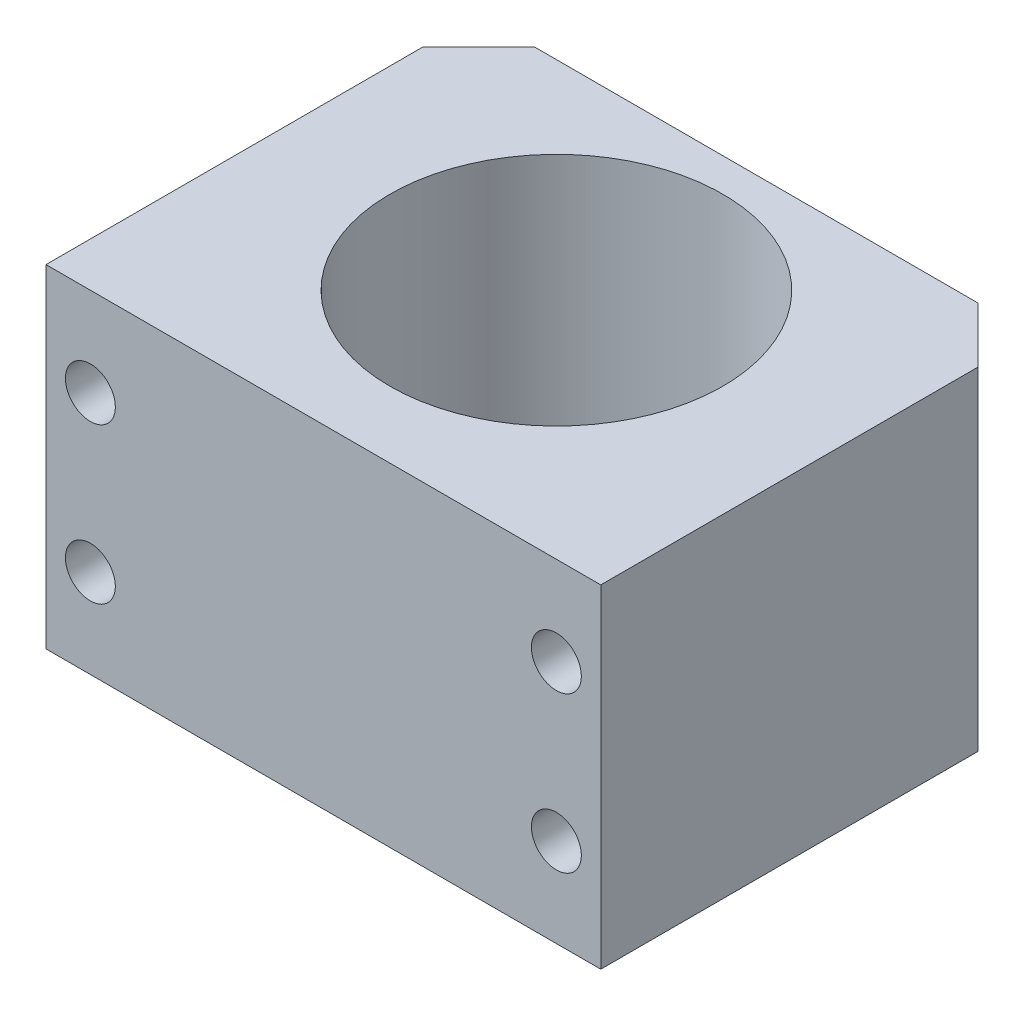
ISO-10303-21;
HEADER;
FILE_DESCRIPTION(('STEP AP214'),'2;1');
FILE_NAME('part.step','',(''),(''),'','','');
FILE_SCHEMA(('AUTOMOTIVE_DESIGN { 1 0 10303 214 1 1 1 1 }'));
ENDSEC;
DATA;
#1=APPLICATION_CONTEXT('core data for automotive mechanical design processes');
#2=APPLICATION_PROTOCOL_DEFINITION('international standard','automotive_design',2000,#1);
#3=PRODUCT_CONTEXT('',#1,'mechanical');
#4=PRODUCT('Part','Part','',(#3));
#5=PRODUCT_RELATED_PRODUCT_CATEGORY('part','',(#4));
#6=PRODUCT_DEFINITION_FORMATION('','',#4);
#7=PRODUCT_DEFINITION_CONTEXT('part definition',#1,'design');
#8=PRODUCT_DEFINITION('design','',#6,#7);
#9=PRODUCT_DEFINITION_SHAPE('','',#8);
#10=(LENGTH_UNIT() NAMED_UNIT(*) SI_UNIT(.MILLI.,.METRE.));
#11=(NAMED_UNIT(*) PLANE_ANGLE_UNIT() SI_UNIT($,.RADIAN.));
#12=(NAMED_UNIT(*) SI_UNIT($,.STERADIAN.) SOLID_ANGLE_UNIT());
#13=UNCERTAINTY_MEASURE_WITH_UNIT(LENGTH_MEASURE(1.E-05),#10,'distance_accuracy_value','');
#14=(GEOMETRIC_REPRESENTATION_CONTEXT(3) GLOBAL_UNCERTAINTY_ASSIGNED_CONTEXT((#13)) GLOBAL_UNIT_ASSIGNED_CONTEXT((#10,
#11,#12)) REPRESENTATION_CONTEXT('',''));
#15=CARTESIAN_POINT('',(0.,0.,0.));
#16=DIRECTION('',(0.,0.,1.));
#17=DIRECTION('',(1.,0.,0.));
#18=AXIS2_PLACEMENT_3D('',#15,#16,#17);
#19=CARTESIAN_POINT('',(25.,30.,19.5));
#20=DIRECTION('',(-1.,0.,0.));
#21=DIRECTION('',(0.,0.,1.));
#22=AXIS2_PLACEMENT_3D('',#19,#20,#21);
#23=PLANE('',#22);
#24=DIRECTION('',(0.,0.,-1.));
#25=VECTOR('',#24,1.);
#26=CARTESIAN_POINT('',(25.,0.,19.5));
#27=LINE('',#26,#25);
#28=CARTESIAN_POINT('',(25.,0.,19.5));
#29=VERTEX_POINT('',#28);
#30=CARTESIAN_POINT('',(25.,0.,-14.5));
#31=VERTEX_POINT('',#30);
#32=EDGE_CURVE('E135',#29,#31,#27,.T.);
#33=ORIENTED_EDGE('',*,*,#32,.T.);
#34=DIRECTION('',(0.,1.,0.));
#35=VECTOR('',#34,1.);
#36=CARTESIAN_POINT('',(25.,30.,-14.5));
#37=LINE('',#36,#35);
#38=CARTESIAN_POINT('',(25.,30.,-14.5));
#39=VERTEX_POINT('',#38);
#40=EDGE_CURVE('E55',#31,#39,#37,.T.);
#41=ORIENTED_EDGE('',*,*,#40,.T.);
#42=DIRECTION('',(0.,0.,-1.));
#43=VECTOR('',#42,1.);
#44=CARTESIAN_POINT('',(25.,30.,19.5));
#45=LINE('',#44,#43);
#46=CARTESIAN_POINT('',(25.,30.,19.5));
#47=VERTEX_POINT('',#46);
#48=EDGE_CURVE('E138',#47,#39,#45,.T.);
#49=ORIENTED_EDGE('',*,*,#48,.F.);
#50=DIRECTION('',(0.,-1.,0.));
#51=VECTOR('',#50,1.);
#52=CARTESIAN_POINT('',(25.,30.,19.5));
#53=LINE('',#52,#51);
#54=EDGE_CURVE('E147',#47,#29,#53,.T.);
#55=ORIENTED_EDGE('',*,*,#54,.T.);
#56=EDGE_LOOP('',(#33,#41,#49,#55));
#57=FACE_BOUND('',#56,.T.);
#58=ADVANCED_FACE('F32',(#57),#23,.F.);
#59=CARTESIAN_POINT('',(-25.,30.,-19.5));
#60=DIRECTION('',(0.,0.,1.));
#61=DIRECTION('',(1.,0.,0.));
#62=AXIS2_PLACEMENT_3D('',#59,#60,#61);
#63=PLANE('',#62);
#64=DIRECTION('',(-1.,0.,0.));
#65=VECTOR('',#64,1.);
#66=CARTESIAN_POINT('',(-25.,30.,-19.5));
#67=LINE('',#66,#65);
#68=CARTESIAN_POINT('',(20.,30.,-19.5));
#69=VERTEX_POINT('',#68);
#70=CARTESIAN_POINT('',(-20.,30.,-19.5));
#71=VERTEX_POINT('',#70);
#72=EDGE_CURVE('E140',#69,#71,#67,.T.);
#73=ORIENTED_EDGE('',*,*,#72,.F.);
#74=DIRECTION('',(0.,-1.,0.));
#75=VECTOR('',#74,1.);
#76=CARTESIAN_POINT('',(20.,30.,-19.5));
#77=LINE('',#76,#75);
#78=CARTESIAN_POINT('',(20.,0.,-19.5));
#79=VERTEX_POINT('',#78);
#80=EDGE_CURVE('E162',#69,#79,#77,.T.);
#81=ORIENTED_EDGE('',*,*,#80,.T.);
#82=DIRECTION('',(-1.,0.,0.));
#83=VECTOR('',#82,1.);
#84=CARTESIAN_POINT('',(-25.,0.,-19.5));
#85=LINE('',#84,#83);
#86=CARTESIAN_POINT('',(-20.,0.,-19.5));
#87=VERTEX_POINT('',#86);
#88=EDGE_CURVE('E149',#79,#87,#85,.T.);
#89=ORIENTED_EDGE('',*,*,#88,.T.);
#90=DIRECTION('',(0.,1.,0.));
#91=VECTOR('',#90,1.);
#92=CARTESIAN_POINT('',(-20.,30.,-19.5));
#93=LINE('',#92,#91);
#94=EDGE_CURVE('E160',#87,#71,#93,.T.);
#95=ORIENTED_EDGE('',*,*,#94,.T.);
#96=EDGE_LOOP('',(#73,#81,#89,#95));
#97=FACE_BOUND('',#96,.T.);
#98=ADVANCED_FACE('F176',(#97),#63,.F.);
#99=CARTESIAN_POINT('',(-25.,30.,19.5));
#100=DIRECTION('',(1.,0.,0.));
#101=DIRECTION('',(0.,0.,-1.));
#102=AXIS2_PLACEMENT_3D('',#99,#100,#101);
#103=PLANE('',#102);
#104=DIRECTION('',(0.,0.,1.));
#105=VECTOR('',#104,1.);
#106=CARTESIAN_POINT('',(-25.,30.,19.5));
#107=LINE('',#106,#105);
#108=CARTESIAN_POINT('',(-25.,30.,-14.5));
#109=VERTEX_POINT('',#108);
#110=CARTESIAN_POINT('',(-25.,30.,19.5));
#111=VERTEX_POINT('',#110);
#112=EDGE_CURVE('E143',#109,#111,#107,.T.);
#113=ORIENTED_EDGE('',*,*,#112,.F.);
#114=DIRECTION('',(0.,-1.,0.));
#115=VECTOR('',#114,1.);
#116=CARTESIAN_POINT('',(-25.,30.,-14.5));
#117=LINE('',#116,#115);
#118=CARTESIAN_POINT('',(-25.,0.,-14.5));
#119=VERTEX_POINT('',#118);
#120=EDGE_CURVE('E11',#109,#119,#117,.T.);
#121=ORIENTED_EDGE('',*,*,#120,.T.);
#122=DIRECTION('',(0.,0.,1.));
#123=VECTOR('',#122,1.);
#124=CARTESIAN_POINT('',(-25.,0.,19.5));
#125=LINE('',#124,#123);
#126=CARTESIAN_POINT('',(-25.,0.,19.5));
#127=VERTEX_POINT('',#126);
#128=EDGE_CURVE('E152',#119,#127,#125,.T.);
#129=ORIENTED_EDGE('',*,*,#128,.T.);
#130=DIRECTION('',(0.,-1.,0.));
#131=VECTOR('',#130,1.);
#132=CARTESIAN_POINT('',(-25.,30.,19.5));
#133=LINE('',#132,#131);
#134=EDGE_CURVE('E157',#111,#127,#133,.T.);
#135=ORIENTED_EDGE('',*,*,#134,.F.);
#136=EDGE_LOOP('',(#113,#121,#129,#135));
#137=FACE_BOUND('',#136,.T.);
#138=ADVANCED_FACE('F191',(#137),#103,.F.);
#139=CARTESIAN_POINT('',(-25.,30.,19.5));
#140=DIRECTION('',(0.,0.,-1.));
#141=DIRECTION('',(-1.,0.,0.));
#142=AXIS2_PLACEMENT_3D('',#139,#140,#141);
#143=PLANE('',#142);
#144=CARTESIAN_POINT('',(-21.,22.,19.5));
#145=DIRECTION('',(0.,0.,1.));
#146=DIRECTION('',(1.,0.,0.));
#147=AXIS2_PLACEMENT_3D('',#144,#145,#146);
#148=CIRCLE('',#147,2.25);
#149=CARTESIAN_POINT('',(-18.75,22.,19.5));
#150=VERTEX_POINT('',#149);
#151=EDGE_CURVE('E109',#150,#150,#148,.T.);
#152=ORIENTED_EDGE('',*,*,#151,.F.);
#153=EDGE_LOOP('',(#152));
#154=FACE_BOUND('',#153,.T.);
#155=CARTESIAN_POINT('',(21.,22.,19.5));
#156=DIRECTION('',(0.,0.,1.));
#157=DIRECTION('',(1.,0.,0.));
#158=AXIS2_PLACEMENT_3D('',#155,#156,#157);
#159=CIRCLE('',#158,2.25);
#160=CARTESIAN_POINT('',(23.25,22.,19.5));
#161=VERTEX_POINT('',#160);
#162=EDGE_CURVE('E108',#161,#161,#159,.T.);
#163=ORIENTED_EDGE('',*,*,#162,.F.);
#164=EDGE_LOOP('',(#163));
#165=FACE_BOUND('',#164,.T.);
#166=CARTESIAN_POINT('',(21.,8.,19.5));
#167=DIRECTION('',(0.,0.,1.));
#168=DIRECTION('',(1.,0.,0.));
#169=AXIS2_PLACEMENT_3D('',#166,#167,#168);
#170=CIRCLE('',#169,2.25);
#171=CARTESIAN_POINT('',(23.25,8.,19.5));
#172=VERTEX_POINT('',#171);
#173=EDGE_CURVE('E119',#172,#172,#170,.T.);
#174=ORIENTED_EDGE('',*,*,#173,.F.);
#175=EDGE_LOOP('',(#174));
#176=FACE_BOUND('',#175,.T.);
#177=CARTESIAN_POINT('',(-21.,8.,19.5));
#178=DIRECTION('',(0.,0.,1.));
#179=DIRECTION('',(1.,0.,0.));
#180=AXIS2_PLACEMENT_3D('',#177,#178,#179);
#181=CIRCLE('',#180,2.25);
#182=CARTESIAN_POINT('',(-18.75,8.,19.5));
#183=VERTEX_POINT('',#182);
#184=EDGE_CURVE('E125',#183,#183,#181,.T.);
#185=ORIENTED_EDGE('',*,*,#184,.F.);
#186=EDGE_LOOP('',(#185));
#187=FACE_BOUND('',#186,.T.);
#188=DIRECTION('',(1.,0.,0.));
#189=VECTOR('',#188,1.);
#190=CARTESIAN_POINT('',(-25.,0.,19.5));
#191=LINE('',#190,#189);
#192=EDGE_CURVE('E141',#127,#29,#191,.T.);
#193=ORIENTED_EDGE('',*,*,#192,.T.);
#194=ORIENTED_EDGE('',*,*,#54,.F.);
#195=DIRECTION('',(1.,0.,0.));
#196=VECTOR('',#195,1.);
#197=CARTESIAN_POINT('',(-25.,30.,19.5));
#198=LINE('',#197,#196);
#199=EDGE_CURVE('E145',#111,#47,#198,.T.);
#200=ORIENTED_EDGE('',*,*,#199,.F.);
#201=ORIENTED_EDGE('',*,*,#134,.T.);
#202=EDGE_LOOP('',(#193,#194,#200,#201));
#203=FACE_BOUND('',#202,.T.);
#204=ADVANCED_FACE('F187',(#154,#165,#176,#187,#203),#143,.F.);
#205=CARTESIAN_POINT('',(0.,30.,0.));
#206=DIRECTION('',(0.,-1.,0.));
#207=DIRECTION('',(0.,0.,-1.));
#208=AXIS2_PLACEMENT_3D('',#205,#206,#207);
#209=PLANE('',#208);
#210=CARTESIAN_POINT('',(0.,30.,-1.50000000000001));
#211=DIRECTION('',(0.,1.,0.));
#212=DIRECTION('',(0.,0.,1.));
#213=AXIS2_PLACEMENT_3D('',#210,#211,#212);
#214=CIRCLE('',#213,15.);
#215=CARTESIAN_POINT('',(0.,30.,13.5));
#216=VERTEX_POINT('',#215);
#217=EDGE_CURVE('E131',#216,#216,#214,.T.);
#218=ORIENTED_EDGE('',*,*,#217,.F.);
#219=EDGE_LOOP('',(#218));
#220=FACE_BOUND('',#219,.T.);
#221=ORIENTED_EDGE('',*,*,#48,.T.);
#222=DIRECTION('',(0.707106781186547,0.,0.707106781186549));
#223=VECTOR('',#222,1.);
#224=CARTESIAN_POINT('',(20.,30.,-19.5));
#225=LINE('',#224,#223);
#226=EDGE_CURVE('E40',#39,#69,#225,.F.);
#227=ORIENTED_EDGE('',*,*,#226,.T.);
#228=ORIENTED_EDGE('',*,*,#72,.T.);
#229=DIRECTION('',(0.707106781186549,0.,-0.707106781186547));
#230=VECTOR('',#229,1.);
#231=CARTESIAN_POINT('',(-25.,30.,-14.5));
#232=LINE('',#231,#230);
#233=EDGE_CURVE('E47',#71,#109,#232,.F.);
#234=ORIENTED_EDGE('',*,*,#233,.T.);
#235=ORIENTED_EDGE('',*,*,#112,.T.);
#236=ORIENTED_EDGE('',*,*,#199,.T.);
#237=EDGE_LOOP('',(#221,#227,#228,#234,#235,#236));
#238=FACE_BOUND('',#237,.T.);
#239=ADVANCED_FACE('F172',(#220,#238),#209,.F.);
#240=CARTESIAN_POINT('',(0.,0.,0.));
#241=DIRECTION('',(0.,-1.,0.));
#242=DIRECTION('',(0.,0.,-1.));
#243=AXIS2_PLACEMENT_3D('',#240,#241,#242);
#244=PLANE('',#243);
#245=CARTESIAN_POINT('',(0.,0.,-1.50000000000001));
#246=DIRECTION('',(0.,1.,0.));
#247=DIRECTION('',(0.,0.,1.));
#248=AXIS2_PLACEMENT_3D('',#245,#246,#247);
#249=CIRCLE('',#248,15.);
#250=CARTESIAN_POINT('',(0.,0.,13.5));
#251=VERTEX_POINT('',#250);
#252=EDGE_CURVE('E132',#251,#251,#249,.T.);
#253=ORIENTED_EDGE('',*,*,#252,.T.);
#254=EDGE_LOOP('',(#253));
#255=FACE_BOUND('',#254,.T.);
#256=ORIENTED_EDGE('',*,*,#88,.F.);
#257=DIRECTION('',(-0.707106781186547,0.,-0.707106781186549));
#258=VECTOR('',#257,1.);
#259=CARTESIAN_POINT('',(19.75,0.,-19.75));
#260=LINE('',#259,#258);
#261=EDGE_CURVE('E167',#79,#31,#260,.F.);
#262=ORIENTED_EDGE('',*,*,#261,.T.);
#263=ORIENTED_EDGE('',*,*,#32,.F.);
#264=ORIENTED_EDGE('',*,*,#192,.F.);
#265=ORIENTED_EDGE('',*,*,#128,.F.);
#266=DIRECTION('',(-0.707106781186549,0.,0.707106781186547));
#267=VECTOR('',#266,1.);
#268=CARTESIAN_POINT('',(-19.75,0.,-19.75));
#269=LINE('',#268,#267);
#270=EDGE_CURVE('E165',#119,#87,#269,.F.);
#271=ORIENTED_EDGE('',*,*,#270,.T.);
#272=EDGE_LOOP('',(#256,#262,#263,#264,#265,#271));
#273=FACE_BOUND('',#272,.T.);
#274=ADVANCED_FACE('F182',(#255,#273),#244,.T.);
#275=CARTESIAN_POINT('',(0.,0.,-1.50000000000001));
#276=DIRECTION('',(0.,1.,0.));
#277=DIRECTION('',(0.,0.,1.));
#278=AXIS2_PLACEMENT_3D('',#275,#276,#277);
#279=CYLINDRICAL_SURFACE('',#278,15.);
#280=ORIENTED_EDGE('',*,*,#252,.F.);
#281=EDGE_LOOP('',(#280));
#282=FACE_BOUND('',#281,.T.);
#283=ORIENTED_EDGE('',*,*,#217,.T.);
#284=EDGE_LOOP('',(#283));
#285=FACE_BOUND('',#284,.T.);
#286=ADVANCED_FACE('F203',(#282,#285),#279,.F.);
#287=CARTESIAN_POINT('',(20.,30.,-19.5));
#288=DIRECTION('',(-0.707106781186548,0.,0.707106781186546));
#289=DIRECTION('',(0.,-1.,0.));
#290=AXIS2_PLACEMENT_3D('',#287,#288,#289);
#291=PLANE('',#290);
#292=ORIENTED_EDGE('',*,*,#226,.F.);
#293=ORIENTED_EDGE('',*,*,#40,.F.);
#294=ORIENTED_EDGE('',*,*,#261,.F.);
#295=ORIENTED_EDGE('',*,*,#80,.F.);
#296=EDGE_LOOP('',(#292,#293,#294,#295));
#297=FACE_BOUND('',#296,.T.);
#298=ADVANCED_FACE('F179',(#297),#291,.F.);
#299=CARTESIAN_POINT('',(-25.,30.,-14.5));
#300=DIRECTION('',(0.707106781186546,0.,0.707106781186548));
#301=DIRECTION('',(0.,-1.,0.));
#302=AXIS2_PLACEMENT_3D('',#299,#300,#301);
#303=PLANE('',#302);
#304=ORIENTED_EDGE('',*,*,#233,.F.);
#305=ORIENTED_EDGE('',*,*,#94,.F.);
#306=ORIENTED_EDGE('',*,*,#270,.F.);
#307=ORIENTED_EDGE('',*,*,#120,.F.);
#308=EDGE_LOOP('',(#304,#305,#306,#307));
#309=FACE_BOUND('',#308,.T.);
#310=ADVANCED_FACE('F34',(#309),#303,.F.);
#311=CARTESIAN_POINT('',(-21.,8.,-0.500000000000004));
#312=DIRECTION('',(0.,0.,1.));
#313=DIRECTION('',(1.,0.,0.));
#314=AXIS2_PLACEMENT_3D('',#311,#312,#313);
#315=CONICAL_SURFACE('',#314,2.25,1.02974425867665);
#316=CARTESIAN_POINT('',(-21.,8.,-1.85193639281202));
#317=VERTEX_POINT('',#316);
#318=VERTEX_LOOP('',#317);
#319=FACE_BOUND('',#318,.T.);
#320=CARTESIAN_POINT('',(-21.,8.,-0.500000000000004));
#321=DIRECTION('',(0.,0.,1.));
#322=DIRECTION('',(1.,0.,0.));
#323=AXIS2_PLACEMENT_3D('',#320,#321,#322);
#324=CIRCLE('',#323,2.25);
#325=CARTESIAN_POINT('',(-18.75,8.,-0.500000000000004));
#326=VERTEX_POINT('',#325);
#327=EDGE_CURVE('E128',#326,#326,#324,.T.);
#328=ORIENTED_EDGE('',*,*,#327,.T.);
#329=EDGE_LOOP('',(#328));
#330=FACE_BOUND('',#329,.T.);
#331=ADVANCED_FACE('F195',(#319,#330),#315,.F.);
#332=CARTESIAN_POINT('',(-21.,8.,19.5));
#333=DIRECTION('',(0.,0.,1.));
#334=DIRECTION('',(1.,0.,0.));
#335=AXIS2_PLACEMENT_3D('',#332,#333,#334);
#336=CYLINDRICAL_SURFACE('',#335,2.25);
#337=ORIENTED_EDGE('',*,*,#327,.F.);
#338=EDGE_LOOP('',(#337));
#339=FACE_BOUND('',#338,.T.);
#340=ORIENTED_EDGE('',*,*,#184,.T.);
#341=EDGE_LOOP('',(#340));
#342=FACE_BOUND('',#341,.T.);
#343=ADVANCED_FACE('F200',(#339,#342),#336,.F.);
#344=CARTESIAN_POINT('',(21.,8.,-0.500000000000004));
#345=DIRECTION('',(0.,0.,1.));
#346=DIRECTION('',(1.,0.,0.));
#347=AXIS2_PLACEMENT_3D('',#344,#345,#346);
#348=CONICAL_SURFACE('',#347,2.25,1.02974425867665);
#349=CARTESIAN_POINT('',(21.,8.,-1.85193639281202));
#350=VERTEX_POINT('',#349);
#351=VERTEX_LOOP('',#350);
#352=FACE_BOUND('',#351,.T.);
#353=CARTESIAN_POINT('',(21.,8.,-0.500000000000004));
#354=DIRECTION('',(0.,0.,1.));
#355=DIRECTION('',(1.,0.,0.));
#356=AXIS2_PLACEMENT_3D('',#353,#354,#355);
#357=CIRCLE('',#356,2.25);
#358=CARTESIAN_POINT('',(23.25,8.,-0.500000000000004));
#359=VERTEX_POINT('',#358);
#360=EDGE_CURVE('E122',#359,#359,#357,.T.);
#361=ORIENTED_EDGE('',*,*,#360,.T.);
#362=EDGE_LOOP('',(#361));
#363=FACE_BOUND('',#362,.T.);
#364=ADVANCED_FACE('F227',(#352,#363),#348,.F.);
#365=CARTESIAN_POINT('',(21.,8.,19.5));
#366=DIRECTION('',(0.,0.,1.));
#367=DIRECTION('',(1.,0.,0.));
#368=AXIS2_PLACEMENT_3D('',#365,#366,#367);
#369=CYLINDRICAL_SURFACE('',#368,2.25);
#370=ORIENTED_EDGE('',*,*,#360,.F.);
#371=EDGE_LOOP('',(#370));
#372=FACE_BOUND('',#371,.T.);
#373=ORIENTED_EDGE('',*,*,#173,.T.);
#374=EDGE_LOOP('',(#373));
#375=FACE_BOUND('',#374,.T.);
#376=ADVANCED_FACE('F231',(#372,#375),#369,.F.);
#377=CARTESIAN_POINT('',(21.,22.,-0.500000000000004));
#378=DIRECTION('',(0.,0.,1.));
#379=DIRECTION('',(1.,0.,0.));
#380=AXIS2_PLACEMENT_3D('',#377,#378,#379);
#381=CONICAL_SURFACE('',#380,2.25,1.02974425867665);
#382=CARTESIAN_POINT('',(21.,22.,-1.85193639281202));
#383=VERTEX_POINT('',#382);
#384=VERTEX_LOOP('',#383);
#385=FACE_BOUND('',#384,.T.);
#386=CARTESIAN_POINT('',(21.,22.,-0.500000000000004));
#387=DIRECTION('',(0.,0.,1.));
#388=DIRECTION('',(1.,0.,0.));
#389=AXIS2_PLACEMENT_3D('',#386,#387,#388);
#390=CIRCLE('',#389,2.25);
#391=CARTESIAN_POINT('',(23.25,22.,-0.500000000000004));
#392=VERTEX_POINT('',#391);
#393=EDGE_CURVE('E112',#392,#392,#390,.T.);
#394=ORIENTED_EDGE('',*,*,#393,.T.);
#395=EDGE_LOOP('',(#394));
#396=FACE_BOUND('',#395,.T.);
#397=ADVANCED_FACE('F235',(#385,#396),#381,.F.);
#398=CARTESIAN_POINT('',(21.,22.,19.5));
#399=DIRECTION('',(0.,0.,1.));
#400=DIRECTION('',(1.,0.,0.));
#401=AXIS2_PLACEMENT_3D('',#398,#399,#400);
#402=CYLINDRICAL_SURFACE('',#401,2.25);
#403=ORIENTED_EDGE('',*,*,#393,.F.);
#404=EDGE_LOOP('',(#403));
#405=FACE_BOUND('',#404,.T.);
#406=ORIENTED_EDGE('',*,*,#162,.T.);
#407=EDGE_LOOP('',(#406));
#408=FACE_BOUND('',#407,.T.);
#409=ADVANCED_FACE('F102',(#405,#408),#402,.F.);
#410=CARTESIAN_POINT('',(-21.,22.,-0.500000000000004));
#411=DIRECTION('',(0.,0.,1.));
#412=DIRECTION('',(1.,0.,0.));
#413=AXIS2_PLACEMENT_3D('',#410,#411,#412);
#414=CONICAL_SURFACE('',#413,2.25,1.02974425867665);
#415=CARTESIAN_POINT('',(-21.,22.,-1.85193639281202));
#416=VERTEX_POINT('',#415);
#417=VERTEX_LOOP('',#416);
#418=FACE_BOUND('',#417,.T.);
#419=CARTESIAN_POINT('',(-21.,22.,-0.500000000000004));
#420=DIRECTION('',(0.,0.,1.));
#421=DIRECTION('',(1.,0.,0.));
#422=AXIS2_PLACEMENT_3D('',#419,#420,#421);
#423=CIRCLE('',#422,2.25);
#424=CARTESIAN_POINT('',(-18.75,22.,-0.500000000000004));
#425=VERTEX_POINT('',#424);
#426=EDGE_CURVE('E106',#425,#425,#423,.T.);
#427=ORIENTED_EDGE('',*,*,#426,.T.);
#428=EDGE_LOOP('',(#427));
#429=FACE_BOUND('',#428,.T.);
#430=ADVANCED_FACE('F98',(#418,#429),#414,.F.);
#431=CARTESIAN_POINT('',(-21.,22.,19.5));
#432=DIRECTION('',(0.,0.,1.));
#433=DIRECTION('',(1.,0.,0.));
#434=AXIS2_PLACEMENT_3D('',#431,#432,#433);
#435=CYLINDRICAL_SURFACE('',#434,2.25);
#436=ORIENTED_EDGE('',*,*,#426,.F.);
#437=EDGE_LOOP('',(#436));
#438=FACE_BOUND('',#437,.T.);
#439=ORIENTED_EDGE('',*,*,#151,.T.);
#440=EDGE_LOOP('',(#439));
#441=FACE_BOUND('',#440,.T.);
#442=ADVANCED_FACE('F101',(#438,#441),#435,.F.);
#443=CLOSED_SHELL('',(#58,#98,#138,#204,#239,#274,#286,#298,#310,#331,#343,#364,#376,#397,#409,
#430,#442));
#444=MANIFOLD_SOLID_BREP('B2',#443);
#445=ADVANCED_BREP_SHAPE_REPRESENTATION('',(#18,#444),#14);
#446=SHAPE_DEFINITION_REPRESENTATION(#9,#445);
ENDSEC;
END-ISO-10303-21;
